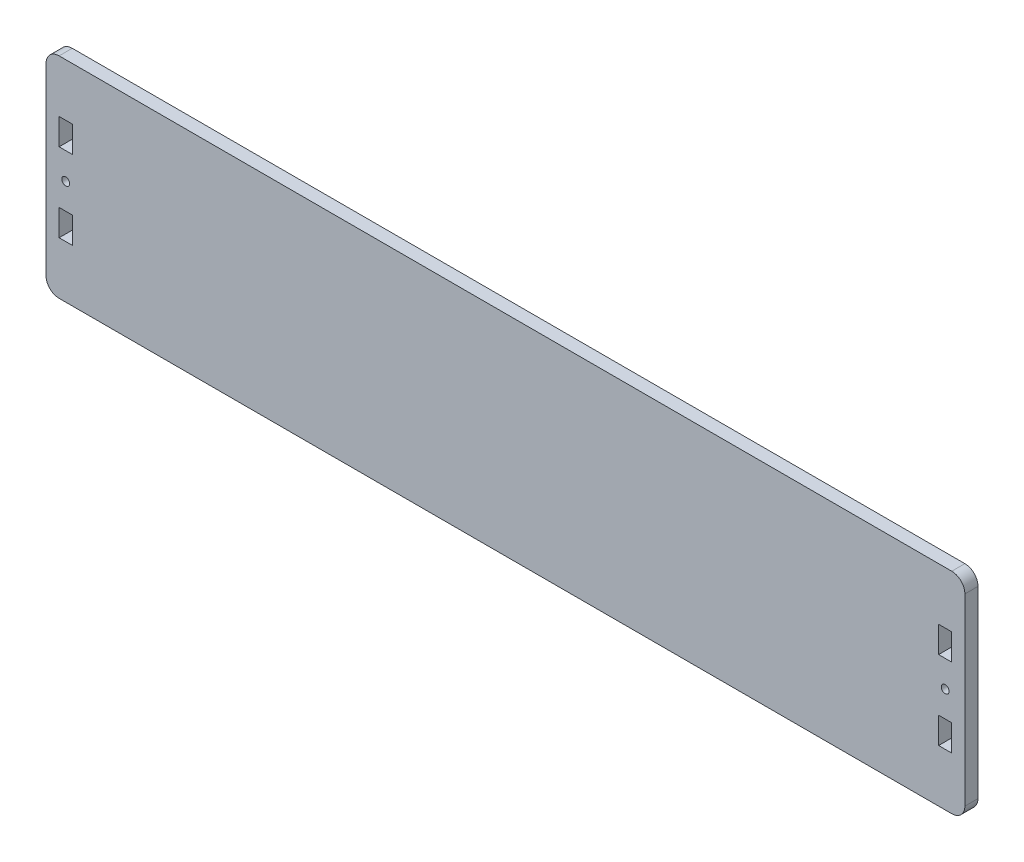
ISO-10303-21;
HEADER;
FILE_DESCRIPTION(('STEP AP214'),'2;1');
FILE_NAME('part.step','',(''),(''),'','','');
FILE_SCHEMA(('AUTOMOTIVE_DESIGN { 1 0 10303 214 1 1 1 1 }'));
ENDSEC;
DATA;
#1=APPLICATION_CONTEXT('core data for automotive mechanical design processes');
#2=APPLICATION_PROTOCOL_DEFINITION('international standard','automotive_design',2000,#1);
#3=PRODUCT_CONTEXT('',#1,'mechanical');
#4=PRODUCT('Part','Part','',(#3));
#5=PRODUCT_RELATED_PRODUCT_CATEGORY('part','',(#4));
#6=PRODUCT_DEFINITION_FORMATION('','',#4);
#7=PRODUCT_DEFINITION_CONTEXT('part definition',#1,'design');
#8=PRODUCT_DEFINITION('design','',#6,#7);
#9=PRODUCT_DEFINITION_SHAPE('','',#8);
#10=(LENGTH_UNIT() NAMED_UNIT(*) SI_UNIT(.MILLI.,.METRE.));
#11=(NAMED_UNIT(*) PLANE_ANGLE_UNIT() SI_UNIT($,.RADIAN.));
#12=(NAMED_UNIT(*) SI_UNIT($,.STERADIAN.) SOLID_ANGLE_UNIT());
#13=UNCERTAINTY_MEASURE_WITH_UNIT(LENGTH_MEASURE(1.E-05),#10,'distance_accuracy_value','');
#14=(GEOMETRIC_REPRESENTATION_CONTEXT(3) GLOBAL_UNCERTAINTY_ASSIGNED_CONTEXT((#13)) GLOBAL_UNIT_ASSIGNED_CONTEXT((#10,
#11,#12)) REPRESENTATION_CONTEXT('',''));
#15=CARTESIAN_POINT('',(0.,0.,0.));
#16=DIRECTION('',(0.,0.,1.));
#17=DIRECTION('',(1.,0.,0.));
#18=AXIS2_PLACEMENT_3D('',#15,#16,#17);
#19=CARTESIAN_POINT('',(0.,0.,5.));
#20=DIRECTION('',(0.,0.,1.));
#21=DIRECTION('',(1.,0.,0.));
#22=AXIS2_PLACEMENT_3D('',#19,#20,#21);
#23=PLANE('',#22);
#24=CARTESIAN_POINT('',(-89.1308451282426,12.3040988995058,5.));
#25=DIRECTION('',(0.,0.,1.));
#26=DIRECTION('',(1.,0.,0.));
#27=AXIS2_PLACEMENT_3D('',#24,#25,#26);
#28=CIRCLE('',#27,1.5);
#29=CARTESIAN_POINT('',(-87.6308451282426,12.3040988995058,5.));
#30=VERTEX_POINT('',#29);
#31=EDGE_CURVE('E274',#30,#30,#28,.T.);
#32=ORIENTED_EDGE('',*,*,#31,.F.);
#33=EDGE_LOOP('',(#32));
#34=FACE_BOUND('',#33,.T.);
#35=DIRECTION('',(0.,1.,0.));
#36=VECTOR('',#35,1.);
#37=CARTESIAN_POINT('',(253.369154871757,52.4585861651762,5.));
#38=LINE('',#37,#36);
#39=CARTESIAN_POINT('',(253.369154871757,-22.5414138348238,5.));
#40=VERTEX_POINT('',#39);
#41=CARTESIAN_POINT('',(253.369154871757,47.4585861651762,5.));
#42=VERTEX_POINT('',#41);
#43=EDGE_CURVE('E347',#40,#42,#38,.T.);
#44=ORIENTED_EDGE('',*,*,#43,.T.);
#45=CARTESIAN_POINT('',(248.369154871757,47.4585861651762,5.));
#46=DIRECTION('',(0.,0.,1.));
#47=DIRECTION('',(1.,0.,0.));
#48=AXIS2_PLACEMENT_3D('',#45,#46,#47);
#49=CIRCLE('',#48,5.);
#50=CARTESIAN_POINT('',(248.369154871757,52.4585861651762,5.));
#51=VERTEX_POINT('',#50);
#52=EDGE_CURVE('E385',#42,#51,#49,.T.);
#53=ORIENTED_EDGE('',*,*,#52,.T.);
#54=DIRECTION('',(-1.,0.,0.));
#55=VECTOR('',#54,1.);
#56=CARTESIAN_POINT('',(-96.6308451282426,52.4585861651762,5.));
#57=LINE('',#56,#55);
#58=CARTESIAN_POINT('',(-91.6308451282426,52.4585861651762,5.));
#59=VERTEX_POINT('',#58);
#60=EDGE_CURVE('E350',#51,#59,#57,.T.);
#61=ORIENTED_EDGE('',*,*,#60,.T.);
#62=CARTESIAN_POINT('',(-91.6308451282426,47.4585861651762,5.));
#63=DIRECTION('',(0.,0.,1.));
#64=DIRECTION('',(1.,0.,0.));
#65=AXIS2_PLACEMENT_3D('',#62,#63,#64);
#66=CIRCLE('',#65,5.);
#67=CARTESIAN_POINT('',(-96.6308451282426,47.4585861651762,5.));
#68=VERTEX_POINT('',#67);
#69=EDGE_CURVE('E380',#59,#68,#66,.T.);
#70=ORIENTED_EDGE('',*,*,#69,.T.);
#71=DIRECTION('',(0.,-1.,0.));
#72=VECTOR('',#71,1.);
#73=CARTESIAN_POINT('',(-96.6308451282426,52.4585861651762,5.));
#74=LINE('',#73,#72);
#75=CARTESIAN_POINT('',(-96.6308451282426,-22.5414138348238,5.));
#76=VERTEX_POINT('',#75);
#77=EDGE_CURVE('E342',#68,#76,#74,.T.);
#78=ORIENTED_EDGE('',*,*,#77,.T.);
#79=CARTESIAN_POINT('',(-91.6308451282426,-22.5414138348238,5.));
#80=DIRECTION('',(0.,0.,1.));
#81=DIRECTION('',(1.,0.,0.));
#82=AXIS2_PLACEMENT_3D('',#79,#80,#81);
#83=CIRCLE('',#82,5.);
#84=CARTESIAN_POINT('',(-91.6308451282426,-27.5414138348238,5.));
#85=VERTEX_POINT('',#84);
#86=EDGE_CURVE('E55',#76,#85,#83,.T.);
#87=ORIENTED_EDGE('',*,*,#86,.T.);
#88=DIRECTION('',(1.,0.,0.));
#89=VECTOR('',#88,1.);
#90=CARTESIAN_POINT('',(-96.6308451282426,-27.5414138348238,5.));
#91=LINE('',#90,#89);
#92=CARTESIAN_POINT('',(248.369154871757,-27.5414138348238,5.));
#93=VERTEX_POINT('',#92);
#94=EDGE_CURVE('E344',#85,#93,#91,.T.);
#95=ORIENTED_EDGE('',*,*,#94,.T.);
#96=CARTESIAN_POINT('',(248.369154871757,-22.5414138348238,5.));
#97=DIRECTION('',(0.,0.,1.));
#98=DIRECTION('',(1.,0.,0.));
#99=AXIS2_PLACEMENT_3D('',#96,#97,#98);
#100=CIRCLE('',#99,5.);
#101=EDGE_CURVE('E383',#93,#40,#100,.T.);
#102=ORIENTED_EDGE('',*,*,#101,.T.);
#103=EDGE_LOOP('',(#44,#53,#61,#70,#78,#87,#95,#102));
#104=FACE_BOUND('',#103,.T.);
#105=DIRECTION('',(1.,0.,0.));
#106=VECTOR('',#105,1.);
#107=CARTESIAN_POINT('',(-91.6308451282426,22.4585861651762,5.));
#108=LINE('',#107,#106);
#109=CARTESIAN_POINT('',(-91.6308451282426,22.4585861651762,5.));
#110=VERTEX_POINT('',#109);
#111=CARTESIAN_POINT('',(-86.6308451282426,22.4585861651762,5.));
#112=VERTEX_POINT('',#111);
#113=EDGE_CURVE('E313',#110,#112,#108,.T.);
#114=ORIENTED_EDGE('',*,*,#113,.F.);
#115=DIRECTION('',(0.,-1.,0.));
#116=VECTOR('',#115,1.);
#117=CARTESIAN_POINT('',(-91.6308451282426,32.4585861651762,5.));
#118=LINE('',#117,#116);
#119=CARTESIAN_POINT('',(-91.6308451282426,32.4585861651762,5.));
#120=VERTEX_POINT('',#119);
#121=EDGE_CURVE('E311',#120,#110,#118,.T.);
#122=ORIENTED_EDGE('',*,*,#121,.F.);
#123=DIRECTION('',(-1.,0.,0.));
#124=VECTOR('',#123,1.);
#125=CARTESIAN_POINT('',(-91.6308451282426,32.4585861651762,5.));
#126=LINE('',#125,#124);
#127=CARTESIAN_POINT('',(-86.6308451282426,32.4585861651762,5.));
#128=VERTEX_POINT('',#127);
#129=EDGE_CURVE('E319',#128,#120,#126,.T.);
#130=ORIENTED_EDGE('',*,*,#129,.F.);
#131=DIRECTION('',(0.,1.,0.));
#132=VECTOR('',#131,1.);
#133=CARTESIAN_POINT('',(-86.6308451282426,32.4585861651762,5.));
#134=LINE('',#133,#132);
#135=EDGE_CURVE('E316',#112,#128,#134,.T.);
#136=ORIENTED_EDGE('',*,*,#135,.F.);
#137=EDGE_LOOP('',(#114,#122,#130,#136));
#138=FACE_BOUND('',#137,.T.);
#139=DIRECTION('',(1.,0.,0.));
#140=VECTOR('',#139,1.);
#141=CARTESIAN_POINT('',(-91.6308451282426,-7.54141383482376,5.));
#142=LINE('',#141,#140);
#143=CARTESIAN_POINT('',(-91.6308451282426,-7.54141383482376,5.));
#144=VERTEX_POINT('',#143);
#145=CARTESIAN_POINT('',(-86.6308451282426,-7.54141383482376,5.));
#146=VERTEX_POINT('',#145);
#147=EDGE_CURVE('E282',#144,#146,#142,.T.);
#148=ORIENTED_EDGE('',*,*,#147,.F.);
#149=DIRECTION('',(0.,-1.,0.));
#150=VECTOR('',#149,1.);
#151=CARTESIAN_POINT('',(-91.6308451282426,2.45858616517624,5.));
#152=LINE('',#151,#150);
#153=CARTESIAN_POINT('',(-91.6308451282426,2.45858616517624,5.));
#154=VERTEX_POINT('',#153);
#155=EDGE_CURVE('E280',#154,#144,#152,.T.);
#156=ORIENTED_EDGE('',*,*,#155,.F.);
#157=DIRECTION('',(-1.,0.,0.));
#158=VECTOR('',#157,1.);
#159=CARTESIAN_POINT('',(-91.6308451282426,2.45858616517624,5.));
#160=LINE('',#159,#158);
#161=CARTESIAN_POINT('',(-86.6308451282426,2.45858616517624,5.));
#162=VERTEX_POINT('',#161);
#163=EDGE_CURVE('E288',#162,#154,#160,.T.);
#164=ORIENTED_EDGE('',*,*,#163,.F.);
#165=DIRECTION('',(0.,1.,0.));
#166=VECTOR('',#165,1.);
#167=CARTESIAN_POINT('',(-86.6308451282426,2.45858616517624,5.));
#168=LINE('',#167,#166);
#169=EDGE_CURVE('E285',#146,#162,#168,.T.);
#170=ORIENTED_EDGE('',*,*,#169,.F.);
#171=EDGE_LOOP('',(#148,#156,#164,#170));
#172=FACE_BOUND('',#171,.T.);
#173=CARTESIAN_POINT('',(245.869154871757,12.3040988995058,5.));
#174=DIRECTION('',(0.,0.,1.));
#175=DIRECTION('',(-1.,0.,0.));
#176=AXIS2_PLACEMENT_3D('',#173,#174,#175);
#177=CIRCLE('',#176,1.50000000000003);
#178=CARTESIAN_POINT('',(244.369154871757,12.3040988995058,5.));
#179=VERTEX_POINT('',#178);
#180=EDGE_CURVE('E268',#179,#179,#177,.T.);
#181=ORIENTED_EDGE('',*,*,#180,.F.);
#182=EDGE_LOOP('',(#181));
#183=FACE_BOUND('',#182,.T.);
#184=DIRECTION('',(0.,-1.,0.));
#185=VECTOR('',#184,1.);
#186=CARTESIAN_POINT('',(243.369154871757,2.45858616517624,5.));
#187=LINE('',#186,#185);
#188=CARTESIAN_POINT('',(243.369154871757,2.45858616517624,5.));
#189=VERTEX_POINT('',#188);
#190=CARTESIAN_POINT('',(243.369154871757,-7.54141383482376,5.));
#191=VERTEX_POINT('',#190);
#192=EDGE_CURVE('E239',#189,#191,#187,.T.);
#193=ORIENTED_EDGE('',*,*,#192,.F.);
#194=DIRECTION('',(-1.,0.,0.));
#195=VECTOR('',#194,1.);
#196=CARTESIAN_POINT('',(248.369154871757,2.45858616517624,5.));
#197=LINE('',#196,#195);
#198=CARTESIAN_POINT('',(248.369154871757,2.45858616517624,5.));
#199=VERTEX_POINT('',#198);
#200=EDGE_CURVE('E237',#199,#189,#197,.T.);
#201=ORIENTED_EDGE('',*,*,#200,.F.);
#202=DIRECTION('',(0.,1.,0.));
#203=VECTOR('',#202,1.);
#204=CARTESIAN_POINT('',(248.369154871757,2.45858616517624,5.));
#205=LINE('',#204,#203);
#206=CARTESIAN_POINT('',(248.369154871757,-7.54141383482376,5.));
#207=VERTEX_POINT('',#206);
#208=EDGE_CURVE('E245',#207,#199,#205,.T.);
#209=ORIENTED_EDGE('',*,*,#208,.F.);
#210=DIRECTION('',(1.,0.,0.));
#211=VECTOR('',#210,1.);
#212=CARTESIAN_POINT('',(248.369154871757,-7.54141383482376,5.));
#213=LINE('',#212,#211);
#214=EDGE_CURVE('E242',#191,#207,#213,.T.);
#215=ORIENTED_EDGE('',*,*,#214,.F.);
#216=EDGE_LOOP('',(#193,#201,#209,#215));
#217=FACE_BOUND('',#216,.T.);
#218=DIRECTION('',(0.,-1.,0.));
#219=VECTOR('',#218,1.);
#220=CARTESIAN_POINT('',(243.369154871757,32.4585861651762,5.));
#221=LINE('',#220,#219);
#222=CARTESIAN_POINT('',(243.369154871757,32.4585861651762,5.));
#223=VERTEX_POINT('',#222);
#224=CARTESIAN_POINT('',(243.369154871757,22.4585861651762,5.));
#225=VERTEX_POINT('',#224);
#226=EDGE_CURVE('E206',#223,#225,#221,.T.);
#227=ORIENTED_EDGE('',*,*,#226,.F.);
#228=DIRECTION('',(-1.,0.,0.));
#229=VECTOR('',#228,1.);
#230=CARTESIAN_POINT('',(248.369154871757,32.4585861651762,5.));
#231=LINE('',#230,#229);
#232=CARTESIAN_POINT('',(248.369154871757,32.4585861651762,5.));
#233=VERTEX_POINT('',#232);
#234=EDGE_CURVE('E196',#233,#223,#231,.T.);
#235=ORIENTED_EDGE('',*,*,#234,.F.);
#236=DIRECTION('',(0.,1.,0.));
#237=VECTOR('',#236,1.);
#238=CARTESIAN_POINT('',(248.369154871757,32.4585861651762,5.));
#239=LINE('',#238,#237);
#240=CARTESIAN_POINT('',(248.369154871757,22.4585861651762,5.));
#241=VERTEX_POINT('',#240);
#242=EDGE_CURVE('E221',#241,#233,#239,.T.);
#243=ORIENTED_EDGE('',*,*,#242,.F.);
#244=DIRECTION('',(1.,0.,0.));
#245=VECTOR('',#244,1.);
#246=CARTESIAN_POINT('',(248.369154871757,22.4585861651762,5.));
#247=LINE('',#246,#245);
#248=EDGE_CURVE('E219',#225,#241,#247,.T.);
#249=ORIENTED_EDGE('',*,*,#248,.F.);
#250=EDGE_LOOP('',(#227,#235,#243,#249));
#251=FACE_BOUND('',#250,.T.);
#252=ADVANCED_FACE('F33',(#34,#104,#138,#172,#183,#217,#251),#23,.T.);
#253=CARTESIAN_POINT('',(0.,0.,0.));
#254=DIRECTION('',(0.,0.,1.));
#255=DIRECTION('',(1.,0.,0.));
#256=AXIS2_PLACEMENT_3D('',#253,#254,#255);
#257=PLANE('',#256);
#258=DIRECTION('',(-1.,0.,0.));
#259=VECTOR('',#258,1.);
#260=CARTESIAN_POINT('',(248.369154871757,2.45858616517624,0.));
#261=LINE('',#260,#259);
#262=CARTESIAN_POINT('',(248.369154871757,2.45858616517624,0.));
#263=VERTEX_POINT('',#262);
#264=CARTESIAN_POINT('',(243.369154871757,2.45858616517624,0.));
#265=VERTEX_POINT('',#264);
#266=EDGE_CURVE('E214',#263,#265,#261,.T.);
#267=ORIENTED_EDGE('',*,*,#266,.T.);
#268=DIRECTION('',(0.,-1.,0.));
#269=VECTOR('',#268,1.);
#270=CARTESIAN_POINT('',(243.369154871757,2.45858616517624,0.));
#271=LINE('',#270,#269);
#272=CARTESIAN_POINT('',(243.369154871757,-7.54141383482376,0.));
#273=VERTEX_POINT('',#272);
#274=EDGE_CURVE('E250',#265,#273,#271,.T.);
#275=ORIENTED_EDGE('',*,*,#274,.T.);
#276=DIRECTION('',(1.,0.,0.));
#277=VECTOR('',#276,1.);
#278=CARTESIAN_POINT('',(248.369154871757,-7.54141383482376,0.));
#279=LINE('',#278,#277);
#280=CARTESIAN_POINT('',(248.369154871757,-7.54141383482376,0.));
#281=VERTEX_POINT('',#280);
#282=EDGE_CURVE('E253',#273,#281,#279,.T.);
#283=ORIENTED_EDGE('',*,*,#282,.T.);
#284=DIRECTION('',(0.,1.,0.));
#285=VECTOR('',#284,1.);
#286=CARTESIAN_POINT('',(248.369154871757,2.45858616517624,0.));
#287=LINE('',#286,#285);
#288=EDGE_CURVE('E240',#281,#263,#287,.T.);
#289=ORIENTED_EDGE('',*,*,#288,.T.);
#290=EDGE_LOOP('',(#267,#275,#283,#289));
#291=FACE_BOUND('',#290,.T.);
#292=DIRECTION('',(0.,-1.,0.));
#293=VECTOR('',#292,1.);
#294=CARTESIAN_POINT('',(-91.6308451282426,32.4585861651762,0.));
#295=LINE('',#294,#293);
#296=CARTESIAN_POINT('',(-91.6308451282426,32.4585861651762,0.));
#297=VERTEX_POINT('',#296);
#298=CARTESIAN_POINT('',(-91.6308451282426,22.4585861651762,0.));
#299=VERTEX_POINT('',#298);
#300=EDGE_CURVE('E310',#297,#299,#295,.T.);
#301=ORIENTED_EDGE('',*,*,#300,.T.);
#302=DIRECTION('',(1.,0.,0.));
#303=VECTOR('',#302,1.);
#304=CARTESIAN_POINT('',(-91.6308451282426,22.4585861651762,0.));
#305=LINE('',#304,#303);
#306=CARTESIAN_POINT('',(-86.6308451282426,22.4585861651762,0.));
#307=VERTEX_POINT('',#306);
#308=EDGE_CURVE('E324',#299,#307,#305,.T.);
#309=ORIENTED_EDGE('',*,*,#308,.T.);
#310=DIRECTION('',(0.,1.,0.));
#311=VECTOR('',#310,1.);
#312=CARTESIAN_POINT('',(-86.6308451282426,32.4585861651762,0.));
#313=LINE('',#312,#311);
#314=CARTESIAN_POINT('',(-86.6308451282426,32.4585861651762,0.));
#315=VERTEX_POINT('',#314);
#316=EDGE_CURVE('E327',#307,#315,#313,.T.);
#317=ORIENTED_EDGE('',*,*,#316,.T.);
#318=DIRECTION('',(-1.,0.,0.));
#319=VECTOR('',#318,1.);
#320=CARTESIAN_POINT('',(-91.6308451282426,32.4585861651762,0.));
#321=LINE('',#320,#319);
#322=EDGE_CURVE('E314',#315,#297,#321,.T.);
#323=ORIENTED_EDGE('',*,*,#322,.T.);
#324=EDGE_LOOP('',(#301,#309,#317,#323));
#325=FACE_BOUND('',#324,.T.);
#326=DIRECTION('',(-1.,0.,0.));
#327=VECTOR('',#326,1.);
#328=CARTESIAN_POINT('',(-96.6308451282426,52.4585861651762,0.));
#329=LINE('',#328,#327);
#330=CARTESIAN_POINT('',(248.369154871757,52.4585861651762,0.));
#331=VERTEX_POINT('',#330);
#332=CARTESIAN_POINT('',(-91.6308451282426,52.4585861651762,0.));
#333=VERTEX_POINT('',#332);
#334=EDGE_CURVE('E345',#331,#333,#329,.T.);
#335=ORIENTED_EDGE('',*,*,#334,.F.);
#336=CARTESIAN_POINT('',(248.369154871757,47.4585861651762,0.));
#337=DIRECTION('',(0.,0.,1.));
#338=DIRECTION('',(1.,0.,0.));
#339=AXIS2_PLACEMENT_3D('',#336,#337,#338);
#340=CIRCLE('',#339,5.);
#341=CARTESIAN_POINT('',(253.369154871757,47.4585861651762,0.));
#342=VERTEX_POINT('',#341);
#343=EDGE_CURVE('E373',#331,#342,#340,.F.);
#344=ORIENTED_EDGE('',*,*,#343,.T.);
#345=DIRECTION('',(0.,1.,0.));
#346=VECTOR('',#345,1.);
#347=CARTESIAN_POINT('',(253.369154871757,52.4585861651762,0.));
#348=LINE('',#347,#346);
#349=CARTESIAN_POINT('',(253.369154871757,-22.5414138348238,0.));
#350=VERTEX_POINT('',#349);
#351=EDGE_CURVE('E358',#350,#342,#348,.T.);
#352=ORIENTED_EDGE('',*,*,#351,.F.);
#353=CARTESIAN_POINT('',(248.369154871757,-22.5414138348238,0.));
#354=DIRECTION('',(0.,0.,1.));
#355=DIRECTION('',(1.,0.,0.));
#356=AXIS2_PLACEMENT_3D('',#353,#354,#355);
#357=CIRCLE('',#356,5.);
#358=CARTESIAN_POINT('',(248.369154871757,-27.5414138348238,0.));
#359=VERTEX_POINT('',#358);
#360=EDGE_CURVE('E371',#350,#359,#357,.F.);
#361=ORIENTED_EDGE('',*,*,#360,.T.);
#362=DIRECTION('',(1.,0.,0.));
#363=VECTOR('',#362,1.);
#364=CARTESIAN_POINT('',(-96.6308451282426,-27.5414138348238,0.));
#365=LINE('',#364,#363);
#366=CARTESIAN_POINT('',(-91.6308451282426,-27.5414138348238,0.));
#367=VERTEX_POINT('',#366);
#368=EDGE_CURVE('E356',#367,#359,#365,.T.);
#369=ORIENTED_EDGE('',*,*,#368,.F.);
#370=CARTESIAN_POINT('',(-91.6308451282426,-22.5414138348238,0.));
#371=DIRECTION('',(0.,0.,1.));
#372=DIRECTION('',(1.,0.,0.));
#373=AXIS2_PLACEMENT_3D('',#370,#371,#372);
#374=CIRCLE('',#373,5.);
#375=CARTESIAN_POINT('',(-96.6308451282426,-22.5414138348238,0.));
#376=VERTEX_POINT('',#375);
#377=EDGE_CURVE('E369',#367,#376,#374,.F.);
#378=ORIENTED_EDGE('',*,*,#377,.T.);
#379=DIRECTION('',(0.,-1.,0.));
#380=VECTOR('',#379,1.);
#381=CARTESIAN_POINT('',(-96.6308451282426,52.4585861651762,0.));
#382=LINE('',#381,#380);
#383=CARTESIAN_POINT('',(-96.6308451282426,47.4585861651762,0.));
#384=VERTEX_POINT('',#383);
#385=EDGE_CURVE('E341',#384,#376,#382,.T.);
#386=ORIENTED_EDGE('',*,*,#385,.F.);
#387=CARTESIAN_POINT('',(-91.6308451282426,47.4585861651762,0.));
#388=DIRECTION('',(0.,0.,1.));
#389=DIRECTION('',(1.,0.,0.));
#390=AXIS2_PLACEMENT_3D('',#387,#388,#389);
#391=CIRCLE('',#390,5.);
#392=EDGE_CURVE('E367',#384,#333,#391,.F.);
#393=ORIENTED_EDGE('',*,*,#392,.T.);
#394=EDGE_LOOP('',(#335,#344,#352,#361,#369,#378,#386,#393));
#395=FACE_BOUND('',#394,.T.);
#396=DIRECTION('',(0.,-1.,0.));
#397=VECTOR('',#396,1.);
#398=CARTESIAN_POINT('',(-91.6308451282426,2.45858616517624,0.));
#399=LINE('',#398,#397);
#400=CARTESIAN_POINT('',(-91.6308451282426,2.45858616517624,0.));
#401=VERTEX_POINT('',#400);
#402=CARTESIAN_POINT('',(-91.6308451282426,-7.54141383482376,0.));
#403=VERTEX_POINT('',#402);
#404=EDGE_CURVE('E277',#401,#403,#399,.T.);
#405=ORIENTED_EDGE('',*,*,#404,.T.);
#406=DIRECTION('',(1.,0.,0.));
#407=VECTOR('',#406,1.);
#408=CARTESIAN_POINT('',(-91.6308451282426,-7.54141383482376,0.));
#409=LINE('',#408,#407);
#410=CARTESIAN_POINT('',(-86.6308451282426,-7.54141383482376,0.));
#411=VERTEX_POINT('',#410);
#412=EDGE_CURVE('E293',#403,#411,#409,.T.);
#413=ORIENTED_EDGE('',*,*,#412,.T.);
#414=DIRECTION('',(0.,1.,0.));
#415=VECTOR('',#414,1.);
#416=CARTESIAN_POINT('',(-86.6308451282426,2.45858616517624,0.));
#417=LINE('',#416,#415);
#418=CARTESIAN_POINT('',(-86.6308451282426,2.45858616517624,0.));
#419=VERTEX_POINT('',#418);
#420=EDGE_CURVE('E296',#411,#419,#417,.T.);
#421=ORIENTED_EDGE('',*,*,#420,.T.);
#422=DIRECTION('',(-1.,0.,0.));
#423=VECTOR('',#422,1.);
#424=CARTESIAN_POINT('',(-91.6308451282426,2.45858616517624,0.));
#425=LINE('',#424,#423);
#426=EDGE_CURVE('E283',#419,#401,#425,.T.);
#427=ORIENTED_EDGE('',*,*,#426,.T.);
#428=EDGE_LOOP('',(#405,#413,#421,#427));
#429=FACE_BOUND('',#428,.T.);
#430=CARTESIAN_POINT('',(-89.1308451282426,12.3040988995058,0.));
#431=DIRECTION('',(0.,0.,1.));
#432=DIRECTION('',(1.,0.,0.));
#433=AXIS2_PLACEMENT_3D('',#430,#431,#432);
#434=CIRCLE('',#433,1.5);
#435=CARTESIAN_POINT('',(-87.6308451282426,12.3040988995058,0.));
#436=VERTEX_POINT('',#435);
#437=EDGE_CURVE('E271',#436,#436,#434,.T.);
#438=ORIENTED_EDGE('',*,*,#437,.T.);
#439=EDGE_LOOP('',(#438));
#440=FACE_BOUND('',#439,.T.);
#441=CARTESIAN_POINT('',(245.869154871757,12.3040988995058,0.));
#442=DIRECTION('',(0.,0.,1.));
#443=DIRECTION('',(-1.,0.,0.));
#444=AXIS2_PLACEMENT_3D('',#441,#442,#443);
#445=CIRCLE('',#444,1.50000000000003);
#446=CARTESIAN_POINT('',(244.369154871757,12.3040988995058,0.));
#447=VERTEX_POINT('',#446);
#448=EDGE_CURVE('E267',#447,#447,#445,.T.);
#449=ORIENTED_EDGE('',*,*,#448,.T.);
#450=EDGE_LOOP('',(#449));
#451=FACE_BOUND('',#450,.T.);
#452=DIRECTION('',(-1.,0.,0.));
#453=VECTOR('',#452,1.);
#454=CARTESIAN_POINT('',(248.369154871757,32.4585861651762,0.));
#455=LINE('',#454,#453);
#456=CARTESIAN_POINT('',(248.369154871757,32.4585861651762,0.));
#457=VERTEX_POINT('',#456);
#458=CARTESIAN_POINT('',(243.369154871757,32.4585861651762,0.));
#459=VERTEX_POINT('',#458);
#460=EDGE_CURVE('E225',#457,#459,#455,.T.);
#461=ORIENTED_EDGE('',*,*,#460,.T.);
#462=DIRECTION('',(0.,-1.,0.));
#463=VECTOR('',#462,1.);
#464=CARTESIAN_POINT('',(243.369154871757,32.4585861651762,0.));
#465=LINE('',#464,#463);
#466=CARTESIAN_POINT('',(243.369154871757,22.4585861651762,0.));
#467=VERTEX_POINT('',#466);
#468=EDGE_CURVE('E213',#459,#467,#465,.T.);
#469=ORIENTED_EDGE('',*,*,#468,.T.);
#470=DIRECTION('',(1.,0.,0.));
#471=VECTOR('',#470,1.);
#472=CARTESIAN_POINT('',(248.369154871757,22.4585861651762,0.));
#473=LINE('',#472,#471);
#474=CARTESIAN_POINT('',(248.369154871757,22.4585861651762,0.));
#475=VERTEX_POINT('',#474);
#476=EDGE_CURVE('E228',#467,#475,#473,.T.);
#477=ORIENTED_EDGE('',*,*,#476,.T.);
#478=DIRECTION('',(0.,1.,0.));
#479=VECTOR('',#478,1.);
#480=CARTESIAN_POINT('',(248.369154871757,32.4585861651762,0.));
#481=LINE('',#480,#479);
#482=EDGE_CURVE('E207',#475,#457,#481,.T.);
#483=ORIENTED_EDGE('',*,*,#482,.T.);
#484=EDGE_LOOP('',(#461,#469,#477,#483));
#485=FACE_BOUND('',#484,.T.);
#486=ADVANCED_FACE('F401',(#291,#325,#395,#429,#440,#451,#485),#257,.F.);
#487=CARTESIAN_POINT('',(-96.6308451282426,52.4585861651762,5.));
#488=DIRECTION('',(1.,0.,0.));
#489=DIRECTION('',(0.,1.,0.));
#490=AXIS2_PLACEMENT_3D('',#487,#488,#489);
#491=PLANE('',#490);
#492=ORIENTED_EDGE('',*,*,#385,.T.);
#493=DIRECTION('',(0.,0.,-1.));
#494=VECTOR('',#493,1.);
#495=CARTESIAN_POINT('',(-96.6308451282426,-22.5414138348238,5.));
#496=LINE('',#495,#494);
#497=EDGE_CURVE('E11',#376,#76,#496,.F.);
#498=ORIENTED_EDGE('',*,*,#497,.T.);
#499=ORIENTED_EDGE('',*,*,#77,.F.);
#500=DIRECTION('',(0.,0.,-1.));
#501=VECTOR('',#500,1.);
#502=CARTESIAN_POINT('',(-96.6308451282426,47.4585861651762,5.));
#503=LINE('',#502,#501);
#504=EDGE_CURVE('E41',#68,#384,#503,.T.);
#505=ORIENTED_EDGE('',*,*,#504,.T.);
#506=EDGE_LOOP('',(#492,#498,#499,#505));
#507=FACE_BOUND('',#506,.T.);
#508=ADVANCED_FACE('F395',(#507),#491,.F.);
#509=CARTESIAN_POINT('',(-96.6308451282426,-27.5414138348238,5.));
#510=DIRECTION('',(0.,1.,0.));
#511=DIRECTION('',(0.,0.,1.));
#512=AXIS2_PLACEMENT_3D('',#509,#510,#511);
#513=PLANE('',#512);
#514=ORIENTED_EDGE('',*,*,#368,.T.);
#515=DIRECTION('',(0.,0.,-1.));
#516=VECTOR('',#515,1.);
#517=CARTESIAN_POINT('',(248.369154871757,-27.5414138348238,5.));
#518=LINE('',#517,#516);
#519=EDGE_CURVE('E48',#359,#93,#518,.F.);
#520=ORIENTED_EDGE('',*,*,#519,.T.);
#521=ORIENTED_EDGE('',*,*,#94,.F.);
#522=DIRECTION('',(0.,0.,-1.));
#523=VECTOR('',#522,1.);
#524=CARTESIAN_POINT('',(-91.6308451282426,-27.5414138348238,5.));
#525=LINE('',#524,#523);
#526=EDGE_CURVE('E387',#85,#367,#525,.T.);
#527=ORIENTED_EDGE('',*,*,#526,.T.);
#528=EDGE_LOOP('',(#514,#520,#521,#527));
#529=FACE_BOUND('',#528,.T.);
#530=ADVANCED_FACE('F407',(#529),#513,.F.);
#531=CARTESIAN_POINT('',(253.369154871757,52.4585861651762,5.));
#532=DIRECTION('',(-1.,0.,0.));
#533=DIRECTION('',(0.,0.,1.));
#534=AXIS2_PLACEMENT_3D('',#531,#532,#533);
#535=PLANE('',#534);
#536=ORIENTED_EDGE('',*,*,#351,.T.);
#537=DIRECTION('',(0.,0.,-1.));
#538=VECTOR('',#537,1.);
#539=CARTESIAN_POINT('',(253.369154871757,47.4585861651762,5.));
#540=LINE('',#539,#538);
#541=EDGE_CURVE('E378',#342,#42,#540,.F.);
#542=ORIENTED_EDGE('',*,*,#541,.T.);
#543=ORIENTED_EDGE('',*,*,#43,.F.);
#544=DIRECTION('',(0.,0.,-1.));
#545=VECTOR('',#544,1.);
#546=CARTESIAN_POINT('',(253.369154871757,-22.5414138348238,5.));
#547=LINE('',#546,#545);
#548=EDGE_CURVE('E375',#40,#350,#547,.T.);
#549=ORIENTED_EDGE('',*,*,#548,.T.);
#550=EDGE_LOOP('',(#536,#542,#543,#549));
#551=FACE_BOUND('',#550,.T.);
#552=ADVANCED_FACE('F416',(#551),#535,.F.);
#553=CARTESIAN_POINT('',(-96.6308451282426,52.4585861651762,5.));
#554=DIRECTION('',(0.,-1.,0.));
#555=DIRECTION('',(1.,0.,0.));
#556=AXIS2_PLACEMENT_3D('',#553,#554,#555);
#557=PLANE('',#556);
#558=ORIENTED_EDGE('',*,*,#60,.F.);
#559=DIRECTION('',(0.,0.,-1.));
#560=VECTOR('',#559,1.);
#561=CARTESIAN_POINT('',(248.369154871757,52.4585861651762,5.));
#562=LINE('',#561,#560);
#563=EDGE_CURVE('E364',#51,#331,#562,.T.);
#564=ORIENTED_EDGE('',*,*,#563,.T.);
#565=ORIENTED_EDGE('',*,*,#334,.T.);
#566=DIRECTION('',(0.,0.,-1.));
#567=VECTOR('',#566,1.);
#568=CARTESIAN_POINT('',(-91.6308451282426,52.4585861651762,5.));
#569=LINE('',#568,#567);
#570=EDGE_CURVE('E353',#333,#59,#569,.F.);
#571=ORIENTED_EDGE('',*,*,#570,.T.);
#572=EDGE_LOOP('',(#558,#564,#565,#571));
#573=FACE_BOUND('',#572,.T.);
#574=ADVANCED_FACE('F424',(#573),#557,.F.);
#575=CARTESIAN_POINT('',(-91.6308451282426,32.4585861651762,5.));
#576=DIRECTION('',(1.,0.,0.));
#577=DIRECTION('',(0.,0.,-1.));
#578=AXIS2_PLACEMENT_3D('',#575,#576,#577);
#579=PLANE('',#578);
#580=ORIENTED_EDGE('',*,*,#300,.F.);
#581=DIRECTION('',(0.,0.,-1.));
#582=VECTOR('',#581,1.);
#583=CARTESIAN_POINT('',(-91.6308451282426,32.4585861651762,5.));
#584=LINE('',#583,#582);
#585=EDGE_CURVE('E321',#120,#297,#584,.T.);
#586=ORIENTED_EDGE('',*,*,#585,.F.);
#587=ORIENTED_EDGE('',*,*,#121,.T.);
#588=DIRECTION('',(0.,0.,-1.));
#589=VECTOR('',#588,1.);
#590=CARTESIAN_POINT('',(-91.6308451282426,22.4585861651762,5.));
#591=LINE('',#590,#589);
#592=EDGE_CURVE('E338',#110,#299,#591,.T.);
#593=ORIENTED_EDGE('',*,*,#592,.T.);
#594=EDGE_LOOP('',(#580,#586,#587,#593));
#595=FACE_BOUND('',#594,.T.);
#596=ADVANCED_FACE('F441',(#595),#579,.T.);
#597=CARTESIAN_POINT('',(-91.6308451282426,22.4585861651762,5.));
#598=DIRECTION('',(0.,1.,0.));
#599=DIRECTION('',(0.,0.,1.));
#600=AXIS2_PLACEMENT_3D('',#597,#598,#599);
#601=PLANE('',#600);
#602=ORIENTED_EDGE('',*,*,#308,.F.);
#603=ORIENTED_EDGE('',*,*,#592,.F.);
#604=ORIENTED_EDGE('',*,*,#113,.T.);
#605=DIRECTION('',(0.,0.,-1.));
#606=VECTOR('',#605,1.);
#607=CARTESIAN_POINT('',(-86.6308451282426,22.4585861651762,5.));
#608=LINE('',#607,#606);
#609=EDGE_CURVE('E336',#112,#307,#608,.T.);
#610=ORIENTED_EDGE('',*,*,#609,.T.);
#611=EDGE_LOOP('',(#602,#603,#604,#610));
#612=FACE_BOUND('',#611,.T.);
#613=ADVANCED_FACE('F614',(#612),#601,.T.);
#614=CARTESIAN_POINT('',(-86.6308451282426,32.4585861651762,5.));
#615=DIRECTION('',(-1.,0.,0.));
#616=DIRECTION('',(0.,0.,1.));
#617=AXIS2_PLACEMENT_3D('',#614,#615,#616);
#618=PLANE('',#617);
#619=ORIENTED_EDGE('',*,*,#316,.F.);
#620=ORIENTED_EDGE('',*,*,#609,.F.);
#621=ORIENTED_EDGE('',*,*,#135,.T.);
#622=DIRECTION('',(0.,0.,-1.));
#623=VECTOR('',#622,1.);
#624=CARTESIAN_POINT('',(-86.6308451282426,32.4585861651762,5.));
#625=LINE('',#624,#623);
#626=EDGE_CURVE('E334',#128,#315,#625,.T.);
#627=ORIENTED_EDGE('',*,*,#626,.T.);
#628=EDGE_LOOP('',(#619,#620,#621,#627));
#629=FACE_BOUND('',#628,.T.);
#630=ADVANCED_FACE('F605',(#629),#618,.T.);
#631=CARTESIAN_POINT('',(-91.6308451282426,32.4585861651762,5.));
#632=DIRECTION('',(0.,-1.,0.));
#633=DIRECTION('',(1.,0.,0.));
#634=AXIS2_PLACEMENT_3D('',#631,#632,#633);
#635=PLANE('',#634);
#636=ORIENTED_EDGE('',*,*,#322,.F.);
#637=ORIENTED_EDGE('',*,*,#626,.F.);
#638=ORIENTED_EDGE('',*,*,#129,.T.);
#639=ORIENTED_EDGE('',*,*,#585,.T.);
#640=EDGE_LOOP('',(#636,#637,#638,#639));
#641=FACE_BOUND('',#640,.T.);
#642=ADVANCED_FACE('F596',(#641),#635,.T.);
#643=CARTESIAN_POINT('',(-91.6308451282426,2.45858616517624,5.));
#644=DIRECTION('',(1.,0.,0.));
#645=DIRECTION('',(0.,0.,-1.));
#646=AXIS2_PLACEMENT_3D('',#643,#644,#645);
#647=PLANE('',#646);
#648=ORIENTED_EDGE('',*,*,#404,.F.);
#649=DIRECTION('',(0.,0.,-1.));
#650=VECTOR('',#649,1.);
#651=CARTESIAN_POINT('',(-91.6308451282426,2.45858616517624,5.));
#652=LINE('',#651,#650);
#653=EDGE_CURVE('E290',#154,#401,#652,.T.);
#654=ORIENTED_EDGE('',*,*,#653,.F.);
#655=ORIENTED_EDGE('',*,*,#155,.T.);
#656=DIRECTION('',(0.,0.,-1.));
#657=VECTOR('',#656,1.);
#658=CARTESIAN_POINT('',(-91.6308451282426,-7.54141383482376,5.));
#659=LINE('',#658,#657);
#660=EDGE_CURVE('E307',#144,#403,#659,.T.);
#661=ORIENTED_EDGE('',*,*,#660,.T.);
#662=EDGE_LOOP('',(#648,#654,#655,#661));
#663=FACE_BOUND('',#662,.T.);
#664=ADVANCED_FACE('F587',(#663),#647,.T.);
#665=CARTESIAN_POINT('',(-91.6308451282426,-7.54141383482376,5.));
#666=DIRECTION('',(0.,1.,0.));
#667=DIRECTION('',(0.,0.,1.));
#668=AXIS2_PLACEMENT_3D('',#665,#666,#667);
#669=PLANE('',#668);
#670=ORIENTED_EDGE('',*,*,#412,.F.);
#671=ORIENTED_EDGE('',*,*,#660,.F.);
#672=ORIENTED_EDGE('',*,*,#147,.T.);
#673=DIRECTION('',(0.,0.,-1.));
#674=VECTOR('',#673,1.);
#675=CARTESIAN_POINT('',(-86.6308451282426,-7.54141383482376,5.));
#676=LINE('',#675,#674);
#677=EDGE_CURVE('E305',#146,#411,#676,.T.);
#678=ORIENTED_EDGE('',*,*,#677,.T.);
#679=EDGE_LOOP('',(#670,#671,#672,#678));
#680=FACE_BOUND('',#679,.T.);
#681=ADVANCED_FACE('F578',(#680),#669,.T.);
#682=CARTESIAN_POINT('',(-86.6308451282426,2.45858616517624,5.));
#683=DIRECTION('',(-1.,0.,0.));
#684=DIRECTION('',(0.,0.,1.));
#685=AXIS2_PLACEMENT_3D('',#682,#683,#684);
#686=PLANE('',#685);
#687=ORIENTED_EDGE('',*,*,#420,.F.);
#688=ORIENTED_EDGE('',*,*,#677,.F.);
#689=ORIENTED_EDGE('',*,*,#169,.T.);
#690=DIRECTION('',(0.,0.,-1.));
#691=VECTOR('',#690,1.);
#692=CARTESIAN_POINT('',(-86.6308451282426,2.45858616517624,5.));
#693=LINE('',#692,#691);
#694=EDGE_CURVE('E303',#162,#419,#693,.T.);
#695=ORIENTED_EDGE('',*,*,#694,.T.);
#696=EDGE_LOOP('',(#687,#688,#689,#695));
#697=FACE_BOUND('',#696,.T.);
#698=ADVANCED_FACE('F569',(#697),#686,.T.);
#699=CARTESIAN_POINT('',(-91.6308451282426,2.45858616517624,5.));
#700=DIRECTION('',(0.,-1.,0.));
#701=DIRECTION('',(0.,0.,-1.));
#702=AXIS2_PLACEMENT_3D('',#699,#700,#701);
#703=PLANE('',#702);
#704=ORIENTED_EDGE('',*,*,#426,.F.);
#705=ORIENTED_EDGE('',*,*,#694,.F.);
#706=ORIENTED_EDGE('',*,*,#163,.T.);
#707=ORIENTED_EDGE('',*,*,#653,.T.);
#708=EDGE_LOOP('',(#704,#705,#706,#707));
#709=FACE_BOUND('',#708,.T.);
#710=ADVANCED_FACE('F560',(#709),#703,.T.);
#711=CARTESIAN_POINT('',(-89.1308451282426,12.3040988995058,5.));
#712=DIRECTION('',(0.,0.,-1.));
#713=DIRECTION('',(-1.,0.,0.));
#714=AXIS2_PLACEMENT_3D('',#711,#712,#713);
#715=CYLINDRICAL_SURFACE('',#714,1.5);
#716=ORIENTED_EDGE('',*,*,#31,.T.);
#717=EDGE_LOOP('',(#716));
#718=FACE_BOUND('',#717,.T.);
#719=ORIENTED_EDGE('',*,*,#437,.F.);
#720=EDGE_LOOP('',(#719));
#721=FACE_BOUND('',#720,.T.);
#722=ADVANCED_FACE('F551',(#718,#721),#715,.F.);
#723=CARTESIAN_POINT('',(245.869154871757,12.3040988995058,5.));
#724=DIRECTION('',(0.,0.,-1.));
#725=DIRECTION('',(-1.,0.,0.));
#726=AXIS2_PLACEMENT_3D('',#723,#724,#725);
#727=CYLINDRICAL_SURFACE('',#726,1.50000000000003);
#728=ORIENTED_EDGE('',*,*,#180,.T.);
#729=EDGE_LOOP('',(#728));
#730=FACE_BOUND('',#729,.T.);
#731=ORIENTED_EDGE('',*,*,#448,.F.);
#732=EDGE_LOOP('',(#731));
#733=FACE_BOUND('',#732,.T.);
#734=ADVANCED_FACE('F542',(#730,#733),#727,.F.);
#735=CARTESIAN_POINT('',(248.369154871757,2.45858616517624,5.));
#736=DIRECTION('',(0.,-1.,0.));
#737=DIRECTION('',(0.,0.,-1.));
#738=AXIS2_PLACEMENT_3D('',#735,#736,#737);
#739=PLANE('',#738);
#740=ORIENTED_EDGE('',*,*,#266,.F.);
#741=DIRECTION('',(0.,0.,-1.));
#742=VECTOR('',#741,1.);
#743=CARTESIAN_POINT('',(248.369154871757,2.45858616517624,5.));
#744=LINE('',#743,#742);
#745=EDGE_CURVE('E247',#199,#263,#744,.T.);
#746=ORIENTED_EDGE('',*,*,#745,.F.);
#747=ORIENTED_EDGE('',*,*,#200,.T.);
#748=DIRECTION('',(0.,0.,-1.));
#749=VECTOR('',#748,1.);
#750=CARTESIAN_POINT('',(243.369154871757,2.45858616517624,5.));
#751=LINE('',#750,#749);
#752=EDGE_CURVE('E264',#189,#265,#751,.T.);
#753=ORIENTED_EDGE('',*,*,#752,.T.);
#754=EDGE_LOOP('',(#740,#746,#747,#753));
#755=FACE_BOUND('',#754,.T.);
#756=ADVANCED_FACE('F533',(#755),#739,.T.);
#757=CARTESIAN_POINT('',(243.369154871757,2.45858616517624,5.));
#758=DIRECTION('',(1.,0.,0.));
#759=DIRECTION('',(0.,0.,-1.));
#760=AXIS2_PLACEMENT_3D('',#757,#758,#759);
#761=PLANE('',#760);
#762=ORIENTED_EDGE('',*,*,#274,.F.);
#763=ORIENTED_EDGE('',*,*,#752,.F.);
#764=ORIENTED_EDGE('',*,*,#192,.T.);
#765=DIRECTION('',(0.,0.,-1.));
#766=VECTOR('',#765,1.);
#767=CARTESIAN_POINT('',(243.369154871757,-7.54141383482376,5.));
#768=LINE('',#767,#766);
#769=EDGE_CURVE('E262',#191,#273,#768,.T.);
#770=ORIENTED_EDGE('',*,*,#769,.T.);
#771=EDGE_LOOP('',(#762,#763,#764,#770));
#772=FACE_BOUND('',#771,.T.);
#773=ADVANCED_FACE('F524',(#772),#761,.T.);
#774=CARTESIAN_POINT('',(248.369154871757,-7.54141383482376,5.));
#775=DIRECTION('',(0.,1.,0.));
#776=DIRECTION('',(0.,0.,1.));
#777=AXIS2_PLACEMENT_3D('',#774,#775,#776);
#778=PLANE('',#777);
#779=ORIENTED_EDGE('',*,*,#282,.F.);
#780=ORIENTED_EDGE('',*,*,#769,.F.);
#781=ORIENTED_EDGE('',*,*,#214,.T.);
#782=DIRECTION('',(0.,0.,-1.));
#783=VECTOR('',#782,1.);
#784=CARTESIAN_POINT('',(248.369154871757,-7.54141383482376,5.));
#785=LINE('',#784,#783);
#786=EDGE_CURVE('E260',#207,#281,#785,.T.);
#787=ORIENTED_EDGE('',*,*,#786,.T.);
#788=EDGE_LOOP('',(#779,#780,#781,#787));
#789=FACE_BOUND('',#788,.T.);
#790=ADVANCED_FACE('F515',(#789),#778,.T.);
#791=CARTESIAN_POINT('',(248.369154871757,2.45858616517624,5.));
#792=DIRECTION('',(-1.,0.,0.));
#793=DIRECTION('',(0.,0.,1.));
#794=AXIS2_PLACEMENT_3D('',#791,#792,#793);
#795=PLANE('',#794);
#796=ORIENTED_EDGE('',*,*,#288,.F.);
#797=ORIENTED_EDGE('',*,*,#786,.F.);
#798=ORIENTED_EDGE('',*,*,#208,.T.);
#799=ORIENTED_EDGE('',*,*,#745,.T.);
#800=EDGE_LOOP('',(#796,#797,#798,#799));
#801=FACE_BOUND('',#800,.T.);
#802=ADVANCED_FACE('F507',(#801),#795,.T.);
#803=CARTESIAN_POINT('',(248.369154871757,32.4585861651762,5.));
#804=DIRECTION('',(0.,-1.,0.));
#805=DIRECTION('',(0.,0.,-1.));
#806=AXIS2_PLACEMENT_3D('',#803,#804,#805);
#807=PLANE('',#806);
#808=ORIENTED_EDGE('',*,*,#460,.F.);
#809=DIRECTION('',(0.,0.,-1.));
#810=VECTOR('',#809,1.);
#811=CARTESIAN_POINT('',(248.369154871757,32.4585861651762,5.));
#812=LINE('',#811,#810);
#813=EDGE_CURVE('E202',#233,#457,#812,.T.);
#814=ORIENTED_EDGE('',*,*,#813,.F.);
#815=ORIENTED_EDGE('',*,*,#234,.T.);
#816=DIRECTION('',(0.,0.,-1.));
#817=VECTOR('',#816,1.);
#818=CARTESIAN_POINT('',(243.369154871757,32.4585861651762,5.));
#819=LINE('',#818,#817);
#820=EDGE_CURVE('E199',#223,#459,#819,.T.);
#821=ORIENTED_EDGE('',*,*,#820,.T.);
#822=EDGE_LOOP('',(#808,#814,#815,#821));
#823=FACE_BOUND('',#822,.T.);
#824=ADVANCED_FACE('F198',(#823),#807,.T.);
#825=CARTESIAN_POINT('',(243.369154871757,32.4585861651762,5.));
#826=DIRECTION('',(1.,0.,0.));
#827=DIRECTION('',(0.,1.,0.));
#828=AXIS2_PLACEMENT_3D('',#825,#826,#827);
#829=PLANE('',#828);
#830=ORIENTED_EDGE('',*,*,#468,.F.);
#831=ORIENTED_EDGE('',*,*,#820,.F.);
#832=ORIENTED_EDGE('',*,*,#226,.T.);
#833=DIRECTION('',(0.,0.,-1.));
#834=VECTOR('',#833,1.);
#835=CARTESIAN_POINT('',(243.369154871757,22.4585861651762,5.));
#836=LINE('',#835,#834);
#837=EDGE_CURVE('E215',#225,#467,#836,.T.);
#838=ORIENTED_EDGE('',*,*,#837,.T.);
#839=EDGE_LOOP('',(#830,#831,#832,#838));
#840=FACE_BOUND('',#839,.T.);
#841=ADVANCED_FACE('F210',(#840),#829,.T.);
#842=CARTESIAN_POINT('',(248.369154871757,22.4585861651762,5.));
#843=DIRECTION('',(0.,1.,0.));
#844=DIRECTION('',(0.,0.,1.));
#845=AXIS2_PLACEMENT_3D('',#842,#843,#844);
#846=PLANE('',#845);
#847=ORIENTED_EDGE('',*,*,#476,.F.);
#848=ORIENTED_EDGE('',*,*,#837,.F.);
#849=ORIENTED_EDGE('',*,*,#248,.T.);
#850=DIRECTION('',(0.,0.,-1.));
#851=VECTOR('',#850,1.);
#852=CARTESIAN_POINT('',(248.369154871757,22.4585861651762,5.));
#853=LINE('',#852,#851);
#854=EDGE_CURVE('E234',#241,#475,#853,.T.);
#855=ORIENTED_EDGE('',*,*,#854,.T.);
#856=EDGE_LOOP('',(#847,#848,#849,#855));
#857=FACE_BOUND('',#856,.T.);
#858=ADVANCED_FACE('F483',(#857),#846,.T.);
#859=CARTESIAN_POINT('',(248.369154871757,32.4585861651762,5.));
#860=DIRECTION('',(-1.,0.,0.));
#861=DIRECTION('',(0.,-1.,0.));
#862=AXIS2_PLACEMENT_3D('',#859,#860,#861);
#863=PLANE('',#862);
#864=ORIENTED_EDGE('',*,*,#482,.F.);
#865=ORIENTED_EDGE('',*,*,#854,.F.);
#866=ORIENTED_EDGE('',*,*,#242,.T.);
#867=ORIENTED_EDGE('',*,*,#813,.T.);
#868=EDGE_LOOP('',(#864,#865,#866,#867));
#869=FACE_BOUND('',#868,.T.);
#870=ADVANCED_FACE('F454',(#869),#863,.T.);
#871=CARTESIAN_POINT('',(248.369154871757,47.4585861651762,5.));
#872=DIRECTION('',(0.,0.,-1.));
#873=DIRECTION('',(-1.,0.,0.));
#874=AXIS2_PLACEMENT_3D('',#871,#872,#873);
#875=CYLINDRICAL_SURFACE('',#874,5.);
#876=ORIENTED_EDGE('',*,*,#52,.F.);
#877=ORIENTED_EDGE('',*,*,#541,.F.);
#878=ORIENTED_EDGE('',*,*,#343,.F.);
#879=ORIENTED_EDGE('',*,*,#563,.F.);
#880=EDGE_LOOP('',(#876,#877,#878,#879));
#881=FACE_BOUND('',#880,.T.);
#882=ADVANCED_FACE('F421',(#881),#875,.T.);
#883=CARTESIAN_POINT('',(248.369154871757,-22.5414138348238,5.));
#884=DIRECTION('',(0.,0.,-1.));
#885=DIRECTION('',(-1.,0.,0.));
#886=AXIS2_PLACEMENT_3D('',#883,#884,#885);
#887=CYLINDRICAL_SURFACE('',#886,5.);
#888=ORIENTED_EDGE('',*,*,#101,.F.);
#889=ORIENTED_EDGE('',*,*,#519,.F.);
#890=ORIENTED_EDGE('',*,*,#360,.F.);
#891=ORIENTED_EDGE('',*,*,#548,.F.);
#892=EDGE_LOOP('',(#888,#889,#890,#891));
#893=FACE_BOUND('',#892,.T.);
#894=ADVANCED_FACE('F413',(#893),#887,.T.);
#895=CARTESIAN_POINT('',(-91.6308451282426,-22.5414138348238,5.));
#896=DIRECTION('',(0.,0.,-1.));
#897=DIRECTION('',(-1.,0.,0.));
#898=AXIS2_PLACEMENT_3D('',#895,#896,#897);
#899=CYLINDRICAL_SURFACE('',#898,5.);
#900=ORIENTED_EDGE('',*,*,#86,.F.);
#901=ORIENTED_EDGE('',*,*,#497,.F.);
#902=ORIENTED_EDGE('',*,*,#377,.F.);
#903=ORIENTED_EDGE('',*,*,#526,.F.);
#904=EDGE_LOOP('',(#900,#901,#902,#903));
#905=FACE_BOUND('',#904,.T.);
#906=ADVANCED_FACE('F406',(#905),#899,.T.);
#907=CARTESIAN_POINT('',(-91.6308451282426,47.4585861651762,5.));
#908=DIRECTION('',(0.,0.,-1.));
#909=DIRECTION('',(-1.,0.,0.));
#910=AXIS2_PLACEMENT_3D('',#907,#908,#909);
#911=CYLINDRICAL_SURFACE('',#910,5.);
#912=ORIENTED_EDGE('',*,*,#69,.F.);
#913=ORIENTED_EDGE('',*,*,#570,.F.);
#914=ORIENTED_EDGE('',*,*,#392,.F.);
#915=ORIENTED_EDGE('',*,*,#504,.F.);
#916=EDGE_LOOP('',(#912,#913,#914,#915));
#917=FACE_BOUND('',#916,.T.);
#918=ADVANCED_FACE('F35',(#917),#911,.T.);
#919=CLOSED_SHELL('',(#252,#486,#508,#530,#552,#574,#596,#613,#630,#642,#664,#681,#698,#710,
#722,#734,#756,#773,#790,#802,#824,#841,#858,#870,#882,#894,#906,#918));
#920=MANIFOLD_SOLID_BREP('B2',#919);
#921=ADVANCED_BREP_SHAPE_REPRESENTATION('',(#18,#920),#14);
#922=SHAPE_DEFINITION_REPRESENTATION(#9,#921);
ENDSEC;
END-ISO-10303-21;
